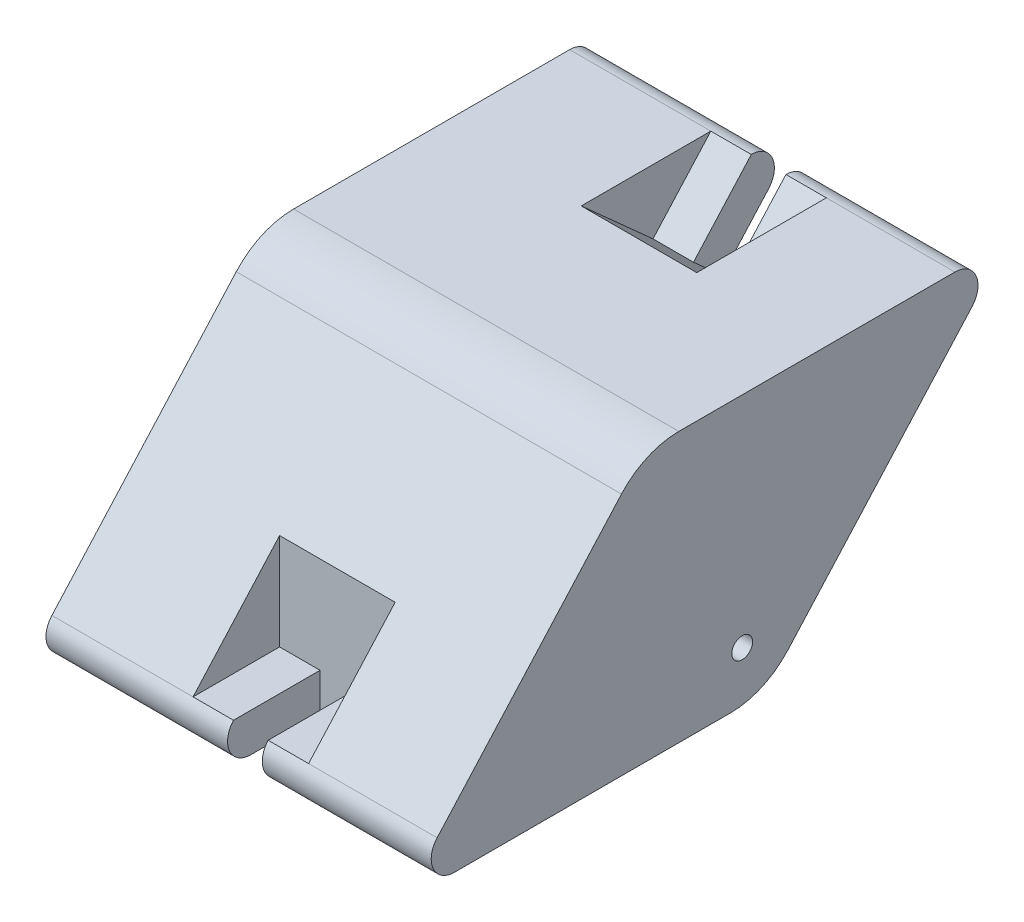
ISO-10303-21;
HEADER;
FILE_DESCRIPTION(('STEP AP214'),'2;1');
FILE_NAME('part.step','',(''),(''),'','','');
FILE_SCHEMA(('AUTOMOTIVE_DESIGN { 1 0 10303 214 1 1 1 1 }'));
ENDSEC;
DATA;
#1=APPLICATION_CONTEXT('core data for automotive mechanical design processes');
#2=APPLICATION_PROTOCOL_DEFINITION('international standard','automotive_design',2000,#1);
#3=PRODUCT_CONTEXT('',#1,'mechanical');
#4=PRODUCT('Part','Part','',(#3));
#5=PRODUCT_RELATED_PRODUCT_CATEGORY('part','',(#4));
#6=PRODUCT_DEFINITION_FORMATION('','',#4);
#7=PRODUCT_DEFINITION_CONTEXT('part definition',#1,'design');
#8=PRODUCT_DEFINITION('design','',#6,#7);
#9=PRODUCT_DEFINITION_SHAPE('','',#8);
#10=(LENGTH_UNIT() NAMED_UNIT(*) SI_UNIT(.MILLI.,.METRE.));
#11=(NAMED_UNIT(*) PLANE_ANGLE_UNIT() SI_UNIT($,.RADIAN.));
#12=(NAMED_UNIT(*) SI_UNIT($,.STERADIAN.) SOLID_ANGLE_UNIT());
#13=UNCERTAINTY_MEASURE_WITH_UNIT(LENGTH_MEASURE(1.E-05),#10,'distance_accuracy_value','');
#14=(GEOMETRIC_REPRESENTATION_CONTEXT(3) GLOBAL_UNCERTAINTY_ASSIGNED_CONTEXT((#13)) GLOBAL_UNIT_ASSIGNED_CONTEXT((#10,
#11,#12)) REPRESENTATION_CONTEXT('',''));
#15=CARTESIAN_POINT('',(0.,0.,0.));
#16=DIRECTION('',(0.,0.,1.));
#17=DIRECTION('',(1.,0.,0.));
#18=AXIS2_PLACEMENT_3D('',#15,#16,#17);
#19=CARTESIAN_POINT('',(10.,13.2280083122286,21.456777394603));
#20=DIRECTION('',(0.,-0.66777921611463,-0.744359401448877));
#21=DIRECTION('',(0.,0.744359401448877,-0.66777921611463));
#22=AXIS2_PLACEMENT_3D('',#19,#20,#21);
#23=PLANE('',#22);
#24=DIRECTION('',(0.,0.744359401448877,-0.66777921611463));
#25=VECTOR('',#24,1.);
#26=CARTESIAN_POINT('',(33.32,13.2280083122286,21.456777394603));
#27=LINE('',#26,#25);
#28=CARTESIAN_POINT('',(33.32,-13.4464462005738,45.3869464637014));
#29=VERTEX_POINT('',#28);
#30=CARTESIAN_POINT('',(33.32,-0.925170954444308,34.1538682593548));
#31=VERTEX_POINT('',#30);
#32=EDGE_CURVE('E11',#29,#31,#27,.T.);
#33=ORIENTED_EDGE('',*,*,#32,.F.);
#34=DIRECTION('',(-1.,0.,0.));
#35=VECTOR('',#34,1.);
#36=CARTESIAN_POINT('',(10.,-13.4464462005738,45.3869464637014));
#37=LINE('',#36,#35);
#38=CARTESIAN_POINT('',(50.,-13.4464462005738,45.3869464637014));
#39=VERTEX_POINT('',#38);
#40=EDGE_CURVE('E389',#39,#29,#37,.T.);
#41=ORIENTED_EDGE('',*,*,#40,.F.);
#42=DIRECTION('',(0.,-0.744359401448877,0.66777921611463));
#43=VECTOR('',#42,1.);
#44=CARTESIAN_POINT('',(50.,16.5642253922856,18.4637925244284));
#45=LINE('',#44,#43);
#46=CARTESIAN_POINT('',(50.,13.2280083122286,21.456777394603));
#47=VERTEX_POINT('',#46);
#48=EDGE_CURVE('E315',#47,#39,#45,.T.);
#49=ORIENTED_EDGE('',*,*,#48,.F.);
#50=DIRECTION('',(-1.,0.,0.));
#51=VECTOR('',#50,1.);
#52=CARTESIAN_POINT('',(10.,13.2280083122286,21.456777394603));
#53=LINE('',#52,#51);
#54=CARTESIAN_POINT('',(0.,13.2280083122286,21.456777394603));
#55=VERTEX_POINT('',#54);
#56=EDGE_CURVE('E392',#47,#55,#53,.T.);
#57=ORIENTED_EDGE('',*,*,#56,.T.);
#58=DIRECTION('',(0.,-0.744359401448877,0.66777921611463));
#59=VECTOR('',#58,1.);
#60=CARTESIAN_POINT('',(0.,13.2280083122286,21.456777394603));
#61=LINE('',#60,#59);
#62=CARTESIAN_POINT('',(0.,-13.4464462005738,45.3869464637014));
#63=VERTEX_POINT('',#62);
#64=EDGE_CURVE('E375',#55,#63,#61,.T.);
#65=ORIENTED_EDGE('',*,*,#64,.T.);
#66=CARTESIAN_POINT('',(18.32,-13.4464462005738,45.3869464637014));
#67=VERTEX_POINT('',#66);
#68=EDGE_CURVE('E388',#67,#63,#37,.T.);
#69=ORIENTED_EDGE('',*,*,#68,.F.);
#70=DIRECTION('',(0.,-0.744359401448877,0.66777921611463));
#71=VECTOR('',#70,1.);
#72=CARTESIAN_POINT('',(18.32,13.2280083122286,21.456777394603));
#73=LINE('',#72,#71);
#74=CARTESIAN_POINT('',(18.32,-0.925170954444308,34.1538682593548));
#75=VERTEX_POINT('',#74);
#76=EDGE_CURVE('E213',#75,#67,#73,.T.);
#77=ORIENTED_EDGE('',*,*,#76,.F.);
#78=DIRECTION('',(1.,0.,0.));
#79=VECTOR('',#78,1.);
#80=CARTESIAN_POINT('',(10.,-0.925170954444308,34.1538682593548));
#81=LINE('',#80,#79);
#82=EDGE_CURVE('E226',#75,#31,#81,.T.);
#83=ORIENTED_EDGE('',*,*,#82,.T.);
#84=EDGE_LOOP('',(#33,#41,#49,#57,#65,#69,#77,#83));
#85=FACE_BOUND('',#84,.T.);
#86=ADVANCED_FACE('F36',(#85),#23,.F.);
#87=CARTESIAN_POINT('',(28.07,-31.265789466894,34.1538682593548));
#88=DIRECTION('',(1.,0.,0.));
#89=DIRECTION('',(0.,0.,-1.));
#90=AXIS2_PLACEMENT_3D('',#87,#88,#89);
#91=PLANE('',#90);
#92=DIRECTION('',(0.,0.,1.));
#93=VECTOR('',#92,1.);
#94=CARTESIAN_POINT('',(28.07,-13.4464462005738,34.1538682593548));
#95=LINE('',#94,#93);
#96=CARTESIAN_POINT('',(28.07,-13.4464462005738,34.1538682593548));
#97=VERTEX_POINT('',#96);
#98=CARTESIAN_POINT('',(28.07,-13.4464462005738,45.3869464637014));
#99=VERTEX_POINT('',#98);
#100=EDGE_CURVE('E233',#97,#99,#95,.T.);
#101=ORIENTED_EDGE('',*,*,#100,.F.);
#102=DIRECTION('',(0.,1.,0.));
#103=VECTOR('',#102,1.);
#104=CARTESIAN_POINT('',(28.07,-31.265789466894,34.1538682593548));
#105=LINE('',#104,#103);
#106=CARTESIAN_POINT('',(28.07,-18.4497838489177,34.1538682593548));
#107=VERTEX_POINT('',#106);
#108=EDGE_CURVE('E238',#107,#97,#105,.T.);
#109=ORIENTED_EDGE('',*,*,#108,.F.);
#110=DIRECTION('',(0.,0.,1.));
#111=VECTOR('',#110,1.);
#112=CARTESIAN_POINT('',(28.07,-18.4497838489177,34.1538682593548));
#113=LINE('',#112,#111);
#114=CARTESIAN_POINT('',(28.07,-18.4497838489177,43.1538682593548));
#115=VERTEX_POINT('',#114);
#116=EDGE_CURVE('E239',#107,#115,#113,.T.);
#117=ORIENTED_EDGE('',*,*,#116,.T.);
#118=CARTESIAN_POINT('',(28.07,-15.4497838489177,43.1538682593548));
#119=DIRECTION('',(1.,0.,0.));
#120=DIRECTION('',(0.,0.,-1.));
#121=AXIS2_PLACEMENT_3D('',#118,#119,#120);
#122=CIRCLE('',#121,3.);
#123=EDGE_CURVE('E251',#99,#115,#122,.T.);
#124=ORIENTED_EDGE('',*,*,#123,.F.);
#125=EDGE_LOOP('',(#101,#109,#117,#124));
#126=FACE_BOUND('',#125,.T.);
#127=ADVANCED_FACE('F471',(#126),#91,.F.);
#128=CARTESIAN_POINT('',(23.57,-31.265789466894,34.1538682593548));
#129=DIRECTION('',(-1.,0.,0.));
#130=DIRECTION('',(0.,0.,1.));
#131=AXIS2_PLACEMENT_3D('',#128,#129,#130);
#132=PLANE('',#131);
#133=DIRECTION('',(0.,0.,-1.));
#134=VECTOR('',#133,1.);
#135=CARTESIAN_POINT('',(23.57,-13.4464462005738,34.1538682593548));
#136=LINE('',#135,#134);
#137=CARTESIAN_POINT('',(23.57,-13.4464462005738,45.3869464637014));
#138=VERTEX_POINT('',#137);
#139=CARTESIAN_POINT('',(23.57,-13.4464462005738,34.1538682593548));
#140=VERTEX_POINT('',#139);
#141=EDGE_CURVE('E216',#138,#140,#136,.T.);
#142=ORIENTED_EDGE('',*,*,#141,.F.);
#143=CARTESIAN_POINT('',(23.57,-15.4497838489177,43.1538682593548));
#144=DIRECTION('',(-1.,0.,0.));
#145=DIRECTION('',(0.,0.,1.));
#146=AXIS2_PLACEMENT_3D('',#143,#144,#145);
#147=CIRCLE('',#146,3.);
#148=CARTESIAN_POINT('',(23.57,-18.4497838489177,43.1538682593548));
#149=VERTEX_POINT('',#148);
#150=EDGE_CURVE('E248',#149,#138,#147,.T.);
#151=ORIENTED_EDGE('',*,*,#150,.F.);
#152=DIRECTION('',(0.,0.,1.));
#153=VECTOR('',#152,1.);
#154=CARTESIAN_POINT('',(23.57,-18.4497838489177,43.1538682593548));
#155=LINE('',#154,#153);
#156=CARTESIAN_POINT('',(23.57,-18.4497838489177,34.1538682593548));
#157=VERTEX_POINT('',#156);
#158=EDGE_CURVE('E44',#157,#149,#155,.T.);
#159=ORIENTED_EDGE('',*,*,#158,.F.);
#160=DIRECTION('',(0.,1.,0.));
#161=VECTOR('',#160,1.);
#162=CARTESIAN_POINT('',(23.57,-31.265789466894,34.1538682593548));
#163=LINE('',#162,#161);
#164=EDGE_CURVE('E56',#157,#140,#163,.T.);
#165=ORIENTED_EDGE('',*,*,#164,.T.);
#166=EDGE_LOOP('',(#142,#151,#159,#165));
#167=FACE_BOUND('',#166,.T.);
#168=ADVANCED_FACE('F479',(#167),#132,.F.);
#169=CARTESIAN_POINT('',(10.,-15.4497838489177,43.1538682593548));
#170=DIRECTION('',(-1.,0.,0.));
#171=DIRECTION('',(0.,0.,1.));
#172=AXIS2_PLACEMENT_3D('',#169,#170,#171);
#173=CYLINDRICAL_SURFACE('',#172,3.);
#174=ORIENTED_EDGE('',*,*,#123,.T.);
#175=DIRECTION('',(-1.,0.,0.));
#176=VECTOR('',#175,1.);
#177=CARTESIAN_POINT('',(10.,-18.4497838489177,43.1538682593548));
#178=LINE('',#177,#176);
#179=CARTESIAN_POINT('',(50.,-18.4497838489177,43.1538682593548));
#180=VERTEX_POINT('',#179);
#181=EDGE_CURVE('E385',#180,#115,#178,.T.);
#182=ORIENTED_EDGE('',*,*,#181,.F.);
#183=CARTESIAN_POINT('',(50.,-15.4497838489177,43.1538682593548));
#184=DIRECTION('',(1.,0.,0.));
#185=DIRECTION('',(0.,0.,-1.));
#186=AXIS2_PLACEMENT_3D('',#183,#184,#185);
#187=CIRCLE('',#186,3.);
#188=EDGE_CURVE('E318',#39,#180,#187,.T.);
#189=ORIENTED_EDGE('',*,*,#188,.F.);
#190=ORIENTED_EDGE('',*,*,#40,.T.);
#191=DIRECTION('',(1.,0.,0.));
#192=VECTOR('',#191,1.);
#193=CARTESIAN_POINT('',(10.,-13.4464462005738,45.3869464637014));
#194=LINE('',#193,#192);
#195=EDGE_CURVE('E235',#99,#29,#194,.T.);
#196=ORIENTED_EDGE('',*,*,#195,.F.);
#197=EDGE_LOOP('',(#174,#182,#189,#190,#196));
#198=FACE_BOUND('',#197,.T.);
#199=ADVANCED_FACE('F465',(#198),#173,.T.);
#200=CARTESIAN_POINT('',(10.,16.5502161510823,14.0131833801142));
#201=DIRECTION('',(0.,-1.,0.));
#202=DIRECTION('',(0.,0.,-1.));
#203=AXIS2_PLACEMENT_3D('',#200,#201,#202);
#204=PLANE('',#203);
#205=DIRECTION('',(0.,0.,-1.));
#206=VECTOR('',#205,1.);
#207=CARTESIAN_POINT('',(33.32,16.5502161510823,14.0131833801142));
#208=LINE('',#207,#206);
#209=CARTESIAN_POINT('',(33.32,16.5502161510823,-5.00072205202531));
#210=VERTEX_POINT('',#209);
#211=CARTESIAN_POINT('',(33.32,16.5502161510823,-21.8222671574638));
#212=VERTEX_POINT('',#211);
#213=EDGE_CURVE('E421',#210,#212,#208,.T.);
#214=ORIENTED_EDGE('',*,*,#213,.F.);
#215=DIRECTION('',(-1.,0.,0.));
#216=VECTOR('',#215,1.);
#217=CARTESIAN_POINT('',(10.,16.5502161510823,-5.00072205202531));
#218=LINE('',#217,#216);
#219=CARTESIAN_POINT('',(18.32,16.5502161510823,-5.00072205202531));
#220=VERTEX_POINT('',#219);
#221=EDGE_CURVE('E414',#210,#220,#218,.T.);
#222=ORIENTED_EDGE('',*,*,#221,.T.);
#223=DIRECTION('',(0.,0.,1.));
#224=VECTOR('',#223,1.);
#225=CARTESIAN_POINT('',(18.32,16.5502161510823,14.0131833801142));
#226=LINE('',#225,#224);
#227=CARTESIAN_POINT('',(18.32,16.5502161510823,-21.8222671574638));
#228=VERTEX_POINT('',#227);
#229=EDGE_CURVE('E418',#228,#220,#226,.T.);
#230=ORIENTED_EDGE('',*,*,#229,.F.);
#231=DIRECTION('',(-1.,0.,0.));
#232=VECTOR('',#231,1.);
#233=CARTESIAN_POINT('',(10.,16.5502161510823,-21.8222671574638));
#234=LINE('',#233,#232);
#235=CARTESIAN_POINT('',(0.,16.5502161510823,-21.8222671574638));
#236=VERTEX_POINT('',#235);
#237=EDGE_CURVE('E399',#228,#236,#234,.T.);
#238=ORIENTED_EDGE('',*,*,#237,.T.);
#239=DIRECTION('',(0.,0.,1.));
#240=VECTOR('',#239,1.);
#241=CARTESIAN_POINT('',(0.,16.5502161510823,14.0131833801142));
#242=LINE('',#241,#240);
#243=CARTESIAN_POINT('',(0.,16.5502161510823,14.0131833801142));
#244=VERTEX_POINT('',#243);
#245=EDGE_CURVE('E371',#236,#244,#242,.T.);
#246=ORIENTED_EDGE('',*,*,#245,.T.);
#247=DIRECTION('',(-1.,0.,0.));
#248=VECTOR('',#247,1.);
#249=CARTESIAN_POINT('',(10.,16.5502161510823,14.0131833801142));
#250=LINE('',#249,#248);
#251=CARTESIAN_POINT('',(50.,16.5502161510823,14.0131833801142));
#252=VERTEX_POINT('',#251);
#253=EDGE_CURVE('E396',#252,#244,#250,.T.);
#254=ORIENTED_EDGE('',*,*,#253,.F.);
#255=DIRECTION('',(0.,0.,1.));
#256=VECTOR('',#255,1.);
#257=CARTESIAN_POINT('',(50.,16.5502161510823,0.));
#258=LINE('',#257,#256);
#259=CARTESIAN_POINT('',(50.,16.5502161510823,-21.8222671574638));
#260=VERTEX_POINT('',#259);
#261=EDGE_CURVE('E309',#260,#252,#258,.T.);
#262=ORIENTED_EDGE('',*,*,#261,.F.);
#263=EDGE_CURVE('E400',#260,#212,#234,.T.);
#264=ORIENTED_EDGE('',*,*,#263,.T.);
#265=EDGE_LOOP('',(#214,#222,#230,#238,#246,#254,#262,#264));
#266=FACE_BOUND('',#265,.T.);
#267=ADVANCED_FACE('F486',(#266),#204,.F.);
#268=CARTESIAN_POINT('',(28.07,5.22169452179214,-35.5983972809166));
#269=DIRECTION('',(1.,0.,0.));
#270=DIRECTION('',(0.,0.,-1.));
#271=AXIS2_PLACEMENT_3D('',#268,#269,#270);
#272=PLANE('',#271);
#273=DIRECTION('',(0.,-0.744359401448877,0.66777921611463));
#274=VECTOR('',#273,1.);
#275=CARTESIAN_POINT('',(28.07,17.121081599853,-22.3344015929865));
#276=LINE('',#275,#274);
#277=CARTESIAN_POINT('',(28.07,16.5502161510823,-21.8222671574638));
#278=VERTEX_POINT('',#277);
#279=CARTESIAN_POINT('',(28.07,8.18876878246644,-14.3210509996109));
#280=VERTEX_POINT('',#279);
#281=EDGE_CURVE('E266',#278,#280,#276,.T.);
#282=ORIENTED_EDGE('',*,*,#281,.F.);
#283=CARTESIAN_POINT('',(28.07,13.5502161510823,-21.8222671574638));
#284=DIRECTION('',(1.,0.,0.));
#285=DIRECTION('',(0.,0.,-1.));
#286=AXIS2_PLACEMENT_3D('',#283,#284,#285);
#287=CIRCLE('',#286,3.);
#288=CARTESIAN_POINT('',(28.07,11.5468785027384,-24.0553453618105));
#289=VERTEX_POINT('',#288);
#290=EDGE_CURVE('E286',#289,#278,#287,.T.);
#291=ORIENTED_EDGE('',*,*,#290,.F.);
#292=DIRECTION('',(0.,-0.744359401448877,0.66777921611463));
#293=VECTOR('',#292,1.);
#294=CARTESIAN_POINT('',(28.07,13.779956707085,-26.0586830101543));
#295=LINE('',#294,#293);
#296=CARTESIAN_POINT('',(28.07,4.84764388969853,-18.0453324167788));
#297=VERTEX_POINT('',#296);
#298=EDGE_CURVE('E278',#289,#297,#295,.T.);
#299=ORIENTED_EDGE('',*,*,#298,.T.);
#300=DIRECTION('',(0.,0.66777921611463,0.744359401448877));
#301=VECTOR('',#300,1.);
#302=CARTESIAN_POINT('',(28.07,-3.71061829559437,-27.5850466875411));
#303=LINE('',#302,#301);
#304=EDGE_CURVE('E276',#297,#280,#303,.T.);
#305=ORIENTED_EDGE('',*,*,#304,.T.);
#306=EDGE_LOOP('',(#282,#291,#299,#305));
#307=FACE_BOUND('',#306,.T.);
#308=ADVANCED_FACE('F504',(#307),#272,.F.);
#309=CARTESIAN_POINT('',(23.57,5.22169452179214,-35.5983972809166));
#310=DIRECTION('',(-1.,0.,0.));
#311=DIRECTION('',(0.,0.,1.));
#312=AXIS2_PLACEMENT_3D('',#309,#310,#311);
#313=PLANE('',#312);
#314=DIRECTION('',(0.,0.744359401448877,-0.66777921611463));
#315=VECTOR('',#314,1.);
#316=CARTESIAN_POINT('',(23.57,17.121081599853,-22.3344015929865));
#317=LINE('',#316,#315);
#318=CARTESIAN_POINT('',(23.57,8.18876878246644,-14.3210509996109));
#319=VERTEX_POINT('',#318);
#320=CARTESIAN_POINT('',(23.57,16.5502161510823,-21.8222671574638));
#321=VERTEX_POINT('',#320);
#322=EDGE_CURVE('E416',#319,#321,#317,.T.);
#323=ORIENTED_EDGE('',*,*,#322,.F.);
#324=DIRECTION('',(0.,0.66777921611463,0.744359401448877));
#325=VECTOR('',#324,1.);
#326=CARTESIAN_POINT('',(23.57,-3.71061829559437,-27.5850466875411));
#327=LINE('',#326,#325);
#328=CARTESIAN_POINT('',(23.57,4.84764388969853,-18.0453324167788));
#329=VERTEX_POINT('',#328);
#330=EDGE_CURVE('E269',#329,#319,#327,.T.);
#331=ORIENTED_EDGE('',*,*,#330,.F.);
#332=DIRECTION('',(0.,0.744359401448877,-0.66777921611463));
#333=VECTOR('',#332,1.);
#334=CARTESIAN_POINT('',(23.57,13.779956707085,-26.0586830101543));
#335=LINE('',#334,#333);
#336=CARTESIAN_POINT('',(23.57,11.5468785027384,-24.0553453618105));
#337=VERTEX_POINT('',#336);
#338=EDGE_CURVE('E272',#329,#337,#335,.T.);
#339=ORIENTED_EDGE('',*,*,#338,.T.);
#340=CARTESIAN_POINT('',(23.57,13.5502161510823,-21.8222671574638));
#341=DIRECTION('',(-1.,0.,0.));
#342=DIRECTION('',(0.,0.,1.));
#343=AXIS2_PLACEMENT_3D('',#340,#341,#342);
#344=CIRCLE('',#343,3.);
#345=EDGE_CURVE('E280',#321,#337,#344,.T.);
#346=ORIENTED_EDGE('',*,*,#345,.F.);
#347=EDGE_LOOP('',(#323,#331,#339,#346));
#348=FACE_BOUND('',#347,.T.);
#349=ADVANCED_FACE('F526',(#348),#313,.F.);
#350=CARTESIAN_POINT('',(10.,13.5502161510823,-21.8222671574638));
#351=DIRECTION('',(-1.,0.,0.));
#352=DIRECTION('',(0.,0.,1.));
#353=AXIS2_PLACEMENT_3D('',#350,#351,#352);
#354=CYLINDRICAL_SURFACE('',#353,3.);
#355=ORIENTED_EDGE('',*,*,#345,.T.);
#356=DIRECTION('',(-1.,0.,0.));
#357=VECTOR('',#356,1.);
#358=CARTESIAN_POINT('',(10.,11.5468785027384,-24.0553453618104));
#359=LINE('',#358,#357);
#360=CARTESIAN_POINT('',(0.,11.5468785027384,-24.0553453618104));
#361=VERTEX_POINT('',#360);
#362=EDGE_CURVE('E403',#337,#361,#359,.T.);
#363=ORIENTED_EDGE('',*,*,#362,.T.);
#364=CARTESIAN_POINT('',(0.,13.5502161510823,-21.8222671574638));
#365=DIRECTION('',(1.,0.,0.));
#366=DIRECTION('',(0.,0.,-1.));
#367=AXIS2_PLACEMENT_3D('',#364,#365,#366);
#368=CIRCLE('',#367,3.);
#369=EDGE_CURVE('E368',#361,#236,#368,.T.);
#370=ORIENTED_EDGE('',*,*,#369,.T.);
#371=ORIENTED_EDGE('',*,*,#237,.F.);
#372=EDGE_CURVE('E404',#321,#228,#234,.T.);
#373=ORIENTED_EDGE('',*,*,#372,.F.);
#374=EDGE_LOOP('',(#355,#363,#370,#371,#373));
#375=FACE_BOUND('',#374,.T.);
#376=ADVANCED_FACE('F509',(#375),#354,.T.);
#377=CARTESIAN_POINT('',(45.,0.,0.));
#378=DIRECTION('',(1.,0.,0.));
#379=DIRECTION('',(0.,0.,-1.));
#380=AXIS2_PLACEMENT_3D('',#377,#378,#379);
#381=PLANE('',#380);
#382=DIRECTION('',(0.,0.,1.));
#383=VECTOR('',#382,1.);
#384=CARTESIAN_POINT('',(45.,-18.4497838489177,0.));
#385=LINE('',#384,#383);
#386=CARTESIAN_POINT('',(45.,-18.4497838489177,7.31841772177667));
#387=VERTEX_POINT('',#386);
#388=CARTESIAN_POINT('',(45.,-18.4497838489177,31.0090755306168));
#389=VERTEX_POINT('',#388);
#390=EDGE_CURVE('E303',#387,#389,#385,.T.);
#391=ORIENTED_EDGE('',*,*,#390,.T.);
#392=CARTESIAN_POINT('',(45.,-11.5096495734594,5.95274545699105));
#393=DIRECTION('',(-1.,0.,0.));
#394=DIRECTION('',(0.,0.,1.));
#395=AXIS2_PLACEMENT_3D('',#392,#393,#394);
#396=CIRCLE('',#395,25.9997142391964);
#397=CARTESIAN_POINT('',(45.,2.50678785645429,-15.9453051935391));
#398=VERTEX_POINT('',#397);
#399=EDGE_CURVE('E336',#389,#398,#396,.T.);
#400=ORIENTED_EDGE('',*,*,#399,.T.);
#401=DIRECTION('',(0.,0.744359401448877,-0.66777921611463));
#402=VECTOR('',#401,1.);
#403=CARTESIAN_POINT('',(45.,-6.80804717172648,-7.58878652628227));
#404=LINE('',#403,#402);
#405=CARTESIAN_POINT('',(45.,-15.127576010064,-0.125176292712019));
#406=VERTEX_POINT('',#405);
#407=EDGE_CURVE('E327',#406,#398,#404,.T.);
#408=ORIENTED_EDGE('',*,*,#407,.F.);
#409=CARTESIAN_POINT('',(45.,-8.44978384891769,7.31841772177678));
#410=DIRECTION('',(1.,0.,0.));
#411=DIRECTION('',(0.,0.,-1.));
#412=AXIS2_PLACEMENT_3D('',#409,#410,#411);
#413=CIRCLE('',#412,10.);
#414=EDGE_CURVE('E298',#406,#387,#413,.F.);
#415=ORIENTED_EDGE('',*,*,#414,.T.);
#416=EDGE_LOOP('',(#391,#400,#408,#415));
#417=FACE_BOUND('',#416,.T.);
#418=CARTESIAN_POINT('',(45.,-11.8749197984836,5.78971888642409));
#419=DIRECTION('',(1.,0.,0.));
#420=DIRECTION('',(0.,0.,-1.));
#421=AXIS2_PLACEMENT_3D('',#418,#419,#420);
#422=CIRCLE('',#421,3.);
#423=CARTESIAN_POINT('',(45.,-11.8749197984836,2.78971888642409));
#424=VERTEX_POINT('',#423);
#425=EDGE_CURVE('E411',#424,#424,#422,.F.);
#426=ORIENTED_EDGE('',*,*,#425,.F.);
#427=EDGE_LOOP('',(#426));
#428=FACE_BOUND('',#427,.T.);
#429=ADVANCED_FACE('F452',(#417,#428),#381,.F.);
#430=CARTESIAN_POINT('',(10.,-8.44978384891769,7.31841772177678));
#431=DIRECTION('',(1.,0.,0.));
#432=DIRECTION('',(0.,0.,-1.));
#433=AXIS2_PLACEMENT_3D('',#430,#431,#432);
#434=PLANE('',#433);
#435=CARTESIAN_POINT('',(10.,-11.5096495734594,5.95274545699105));
#436=DIRECTION('',(1.,0.,0.));
#437=DIRECTION('',(0.,0.,-1.));
#438=AXIS2_PLACEMENT_3D('',#435,#436,#437);
#439=CIRCLE('',#438,3.6);
#440=CARTESIAN_POINT('',(10.,-11.5096495734594,2.35274545699105));
#441=VERTEX_POINT('',#440);
#442=EDGE_CURVE('E348',#441,#441,#439,.T.);
#443=ORIENTED_EDGE('',*,*,#442,.F.);
#444=EDGE_LOOP('',(#443));
#445=FACE_BOUND('',#444,.T.);
#446=CARTESIAN_POINT('',(10.,-11.5096495734594,5.95274545699105));
#447=DIRECTION('',(-1.,0.,0.));
#448=DIRECTION('',(0.,0.,1.));
#449=AXIS2_PLACEMENT_3D('',#446,#447,#448);
#450=CIRCLE('',#449,25.9997142391964);
#451=CARTESIAN_POINT('',(10.,-18.4497838489177,31.0090755306168));
#452=VERTEX_POINT('',#451);
#453=CARTESIAN_POINT('',(10.,2.50678785645429,-15.9453051935391));
#454=VERTEX_POINT('',#453);
#455=EDGE_CURVE('E335',#452,#454,#450,.T.);
#456=ORIENTED_EDGE('',*,*,#455,.F.);
#457=DIRECTION('',(0.,0.,-1.));
#458=VECTOR('',#457,1.);
#459=CARTESIAN_POINT('',(10.,-18.4497838489177,43.1538682593548));
#460=LINE('',#459,#458);
#461=CARTESIAN_POINT('',(10.,-18.4497838489177,7.31841772177682));
#462=VERTEX_POINT('',#461);
#463=EDGE_CURVE('E360',#452,#462,#460,.T.);
#464=ORIENTED_EDGE('',*,*,#463,.T.);
#465=CARTESIAN_POINT('',(10.,-8.44978384891769,7.31841772177678));
#466=DIRECTION('',(1.,0.,0.));
#467=DIRECTION('',(0.,0.,-1.));
#468=AXIS2_PLACEMENT_3D('',#465,#466,#467);
#469=CIRCLE('',#468,10.);
#470=CARTESIAN_POINT('',(10.,-15.127576010064,-0.125176292712019));
#471=VERTEX_POINT('',#470);
#472=EDGE_CURVE('E354',#462,#471,#469,.T.);
#473=ORIENTED_EDGE('',*,*,#472,.T.);
#474=DIRECTION('',(0.,0.744359401448877,-0.66777921611463));
#475=VECTOR('',#474,1.);
#476=CARTESIAN_POINT('',(10.,11.5468785027384,-24.0553453618104));
#477=LINE('',#476,#475);
#478=EDGE_CURVE('E357',#471,#454,#477,.T.);
#479=ORIENTED_EDGE('',*,*,#478,.T.);
#480=EDGE_LOOP('',(#456,#464,#473,#479));
#481=FACE_BOUND('',#480,.T.);
#482=ADVANCED_FACE('F445',(#445,#481),#434,.T.);
#483=CARTESIAN_POINT('',(0.,-8.44978384891769,7.31841772177678));
#484=DIRECTION('',(1.,0.,0.));
#485=DIRECTION('',(0.,0.,-1.));
#486=AXIS2_PLACEMENT_3D('',#483,#484,#485);
#487=PLANE('',#486);
#488=CARTESIAN_POINT('',(0.,-8.44978384891769,7.31841772177678));
#489=DIRECTION('',(1.,0.,0.));
#490=DIRECTION('',(0.,0.,-1.));
#491=AXIS2_PLACEMENT_3D('',#488,#489,#490);
#492=CIRCLE('',#491,10.);
#493=CARTESIAN_POINT('',(0.,-18.4497838489177,7.31841772177682));
#494=VERTEX_POINT('',#493);
#495=CARTESIAN_POINT('',(0.,-15.127576010064,-0.125176292712019));
#496=VERTEX_POINT('',#495);
#497=EDGE_CURVE('E351',#494,#496,#492,.T.);
#498=ORIENTED_EDGE('',*,*,#497,.F.);
#499=DIRECTION('',(0.,0.,-1.));
#500=VECTOR('',#499,1.);
#501=CARTESIAN_POINT('',(0.,-18.4497838489177,43.1538682593548));
#502=LINE('',#501,#500);
#503=CARTESIAN_POINT('',(0.,-18.4497838489177,43.1538682593548));
#504=VERTEX_POINT('',#503);
#505=EDGE_CURVE('E358',#504,#494,#502,.T.);
#506=ORIENTED_EDGE('',*,*,#505,.F.);
#507=CARTESIAN_POINT('',(0.,-15.4497838489177,43.1538682593548));
#508=DIRECTION('',(1.,0.,0.));
#509=DIRECTION('',(0.,0.,-1.));
#510=AXIS2_PLACEMENT_3D('',#507,#508,#509);
#511=CIRCLE('',#510,3.);
#512=EDGE_CURVE('E378',#63,#504,#511,.T.);
#513=ORIENTED_EDGE('',*,*,#512,.F.);
#514=ORIENTED_EDGE('',*,*,#64,.F.);
#515=CARTESIAN_POINT('',(0.,6.55021615108231,14.0131833801142));
#516=DIRECTION('',(1.,0.,0.));
#517=DIRECTION('',(0.,0.,1.));
#518=AXIS2_PLACEMENT_3D('',#515,#516,#517);
#519=CIRCLE('',#518,10.);
#520=EDGE_CURVE('E373',#244,#55,#519,.T.);
#521=ORIENTED_EDGE('',*,*,#520,.F.);
#522=ORIENTED_EDGE('',*,*,#245,.F.);
#523=ORIENTED_EDGE('',*,*,#369,.F.);
#524=DIRECTION('',(0.,0.744359401448877,-0.66777921611463));
#525=VECTOR('',#524,1.);
#526=CARTESIAN_POINT('',(0.,11.5468785027384,-24.0553453618104));
#527=LINE('',#526,#525);
#528=EDGE_CURVE('E365',#496,#361,#527,.T.);
#529=ORIENTED_EDGE('',*,*,#528,.F.);
#530=EDGE_LOOP('',(#498,#506,#513,#514,#521,#522,#523,#529));
#531=FACE_BOUND('',#530,.T.);
#532=CARTESIAN_POINT('',(0.,-11.5096495734594,5.95274545699105));
#533=DIRECTION('',(1.,0.,0.));
#534=DIRECTION('',(0.,0.,-1.));
#535=AXIS2_PLACEMENT_3D('',#532,#533,#534);
#536=CIRCLE('',#535,3.6);
#537=CARTESIAN_POINT('',(0.,-11.5096495734594,2.35274545699105));
#538=VERTEX_POINT('',#537);
#539=EDGE_CURVE('E347',#538,#538,#536,.T.);
#540=ORIENTED_EDGE('',*,*,#539,.T.);
#541=EDGE_LOOP('',(#540));
#542=FACE_BOUND('',#541,.T.);
#543=ADVANCED_FACE('F437',(#531,#542),#487,.F.);
#544=CARTESIAN_POINT('',(10.,-8.44978384891769,7.31841772177678));
#545=DIRECTION('',(-1.,0.,0.));
#546=DIRECTION('',(0.,0.,1.));
#547=AXIS2_PLACEMENT_3D('',#544,#545,#546);
#548=CYLINDRICAL_SURFACE('',#547,10.);
#549=ORIENTED_EDGE('',*,*,#497,.T.);
#550=DIRECTION('',(-1.,0.,0.));
#551=VECTOR('',#550,1.);
#552=CARTESIAN_POINT('',(10.,-15.127576010064,-0.125176292712019));
#553=LINE('',#552,#551);
#554=EDGE_CURVE('E408',#471,#496,#553,.T.);
#555=ORIENTED_EDGE('',*,*,#554,.F.);
#556=ORIENTED_EDGE('',*,*,#472,.F.);
#557=DIRECTION('',(-1.,0.,0.));
#558=VECTOR('',#557,1.);
#559=CARTESIAN_POINT('',(10.,-18.4497838489177,7.31841772177682));
#560=LINE('',#559,#558);
#561=EDGE_CURVE('E362',#462,#494,#560,.T.);
#562=ORIENTED_EDGE('',*,*,#561,.T.);
#563=EDGE_LOOP('',(#549,#555,#556,#562));
#564=FACE_BOUND('',#563,.T.);
#565=ADVANCED_FACE('F38',(#564),#548,.T.);
#566=CARTESIAN_POINT('',(10.,11.5468785027384,-24.0553453618104));
#567=DIRECTION('',(0.,0.66777921611463,0.744359401448877));
#568=DIRECTION('',(0.,-0.744359401448877,0.66777921611463));
#569=AXIS2_PLACEMENT_3D('',#566,#567,#568);
#570=PLANE('',#569);
#571=DIRECTION('',(-1.,0.,0.));
#572=VECTOR('',#571,1.);
#573=CARTESIAN_POINT('',(28.07,4.84764388969853,-18.0453324167788));
#574=LINE('',#573,#572);
#575=EDGE_CURVE('E275',#297,#329,#574,.T.);
#576=ORIENTED_EDGE('',*,*,#575,.F.);
#577=ORIENTED_EDGE('',*,*,#298,.F.);
#578=CARTESIAN_POINT('',(50.,11.5468785027384,-24.0553453618104));
#579=VERTEX_POINT('',#578);
#580=EDGE_CURVE('E405',#579,#289,#359,.T.);
#581=ORIENTED_EDGE('',*,*,#580,.F.);
#582=DIRECTION('',(0.,0.744359401448877,-0.66777921611463));
#583=VECTOR('',#582,1.);
#584=CARTESIAN_POINT('',(50.,-6.80804717172648,-7.58878652628227));
#585=LINE('',#584,#583);
#586=CARTESIAN_POINT('',(50.,-15.127576010064,-0.125176292712019));
#587=VERTEX_POINT('',#586);
#588=EDGE_CURVE('E302',#587,#579,#585,.T.);
#589=ORIENTED_EDGE('',*,*,#588,.F.);
#590=DIRECTION('',(-1.,0.,0.));
#591=VECTOR('',#590,1.);
#592=CARTESIAN_POINT('',(50.,-15.127576010064,-0.125176292712019));
#593=LINE('',#592,#591);
#594=EDGE_CURVE('E333',#587,#406,#593,.T.);
#595=ORIENTED_EDGE('',*,*,#594,.T.);
#596=ORIENTED_EDGE('',*,*,#407,.T.);
#597=DIRECTION('',(-1.,0.,0.));
#598=VECTOR('',#597,1.);
#599=CARTESIAN_POINT('',(45.,2.50678785645429,-15.9453051935391));
#600=LINE('',#599,#598);
#601=EDGE_CURVE('E344',#398,#454,#600,.T.);
#602=ORIENTED_EDGE('',*,*,#601,.T.);
#603=ORIENTED_EDGE('',*,*,#478,.F.);
#604=ORIENTED_EDGE('',*,*,#554,.T.);
#605=ORIENTED_EDGE('',*,*,#528,.T.);
#606=ORIENTED_EDGE('',*,*,#362,.F.);
#607=ORIENTED_EDGE('',*,*,#338,.F.);
#608=EDGE_LOOP('',(#576,#577,#581,#589,#595,#596,#602,#603,#604,#605,#606,#607));
#609=FACE_BOUND('',#608,.T.);
#610=ADVANCED_FACE('F507',(#609),#570,.F.);
#611=ORIENTED_EDGE('',*,*,#290,.T.);
#612=DIRECTION('',(-1.,0.,0.));
#613=VECTOR('',#612,1.);
#614=CARTESIAN_POINT('',(10.,16.5502161510823,-21.8222671574638));
#615=LINE('',#614,#613);
#616=EDGE_CURVE('E267',#212,#278,#615,.T.);
#617=ORIENTED_EDGE('',*,*,#616,.F.);
#618=ORIENTED_EDGE('',*,*,#263,.F.);
#619=CARTESIAN_POINT('',(50.,13.5502161510823,-21.8222671574638));
#620=DIRECTION('',(1.,0.,0.));
#621=DIRECTION('',(0.,0.,-1.));
#622=AXIS2_PLACEMENT_3D('',#619,#620,#621);
#623=CIRCLE('',#622,3.);
#624=EDGE_CURVE('E306',#579,#260,#623,.T.);
#625=ORIENTED_EDGE('',*,*,#624,.F.);
#626=ORIENTED_EDGE('',*,*,#580,.T.);
#627=EDGE_LOOP('',(#611,#617,#618,#625,#626));
#628=FACE_BOUND('',#627,.T.);
#629=ADVANCED_FACE('F500',(#628),#354,.T.);
#630=CARTESIAN_POINT('',(10.,6.55021615108231,14.0131833801142));
#631=DIRECTION('',(-1.,0.,0.));
#632=DIRECTION('',(0.,0.,1.));
#633=AXIS2_PLACEMENT_3D('',#630,#631,#632);
#634=CYLINDRICAL_SURFACE('',#633,10.);
#635=ORIENTED_EDGE('',*,*,#520,.T.);
#636=ORIENTED_EDGE('',*,*,#56,.F.);
#637=CARTESIAN_POINT('',(50.,6.55021615108231,14.0131833801142));
#638=DIRECTION('',(1.,0.,0.));
#639=DIRECTION('',(0.,0.,-1.));
#640=AXIS2_PLACEMENT_3D('',#637,#638,#639);
#641=CIRCLE('',#640,10.);
#642=EDGE_CURVE('E312',#252,#47,#641,.T.);
#643=ORIENTED_EDGE('',*,*,#642,.F.);
#644=ORIENTED_EDGE('',*,*,#253,.T.);
#645=EDGE_LOOP('',(#635,#636,#643,#644));
#646=FACE_BOUND('',#645,.T.);
#647=ADVANCED_FACE('F497',(#646),#634,.T.);
#648=EDGE_CURVE('E384',#149,#504,#178,.T.);
#649=ORIENTED_EDGE('',*,*,#648,.F.);
#650=ORIENTED_EDGE('',*,*,#150,.T.);
#651=EDGE_CURVE('E393',#138,#67,#37,.T.);
#652=ORIENTED_EDGE('',*,*,#651,.T.);
#653=ORIENTED_EDGE('',*,*,#68,.T.);
#654=ORIENTED_EDGE('',*,*,#512,.T.);
#655=EDGE_LOOP('',(#649,#650,#652,#653,#654));
#656=FACE_BOUND('',#655,.T.);
#657=ADVANCED_FACE('F430',(#656),#173,.T.);
#658=CARTESIAN_POINT('',(10.,-18.4497838489177,43.1538682593548));
#659=DIRECTION('',(0.,1.,0.));
#660=DIRECTION('',(0.,0.,1.));
#661=AXIS2_PLACEMENT_3D('',#658,#659,#660);
#662=PLANE('',#661);
#663=ORIENTED_EDGE('',*,*,#181,.T.);
#664=ORIENTED_EDGE('',*,*,#116,.F.);
#665=DIRECTION('',(1.,0.,0.));
#666=VECTOR('',#665,1.);
#667=CARTESIAN_POINT('',(28.07,-18.4497838489177,34.1538682593548));
#668=LINE('',#667,#666);
#669=EDGE_CURVE('E242',#157,#107,#668,.T.);
#670=ORIENTED_EDGE('',*,*,#669,.F.);
#671=ORIENTED_EDGE('',*,*,#158,.T.);
#672=ORIENTED_EDGE('',*,*,#648,.T.);
#673=ORIENTED_EDGE('',*,*,#505,.T.);
#674=ORIENTED_EDGE('',*,*,#561,.F.);
#675=ORIENTED_EDGE('',*,*,#463,.F.);
#676=DIRECTION('',(-1.,0.,0.));
#677=VECTOR('',#676,1.);
#678=CARTESIAN_POINT('',(45.,-18.4497838489177,31.0090755306168));
#679=LINE('',#678,#677);
#680=EDGE_CURVE('E339',#389,#452,#679,.T.);
#681=ORIENTED_EDGE('',*,*,#680,.F.);
#682=ORIENTED_EDGE('',*,*,#390,.F.);
#683=DIRECTION('',(-1.,0.,0.));
#684=VECTOR('',#683,1.);
#685=CARTESIAN_POINT('',(50.,-18.4497838489177,7.31841772177667));
#686=LINE('',#685,#684);
#687=CARTESIAN_POINT('',(50.,-18.4497838489177,7.31841772177667));
#688=VERTEX_POINT('',#687);
#689=EDGE_CURVE('E324',#688,#387,#686,.T.);
#690=ORIENTED_EDGE('',*,*,#689,.F.);
#691=DIRECTION('',(0.,0.,1.));
#692=VECTOR('',#691,1.);
#693=CARTESIAN_POINT('',(50.,-18.4497838489177,0.));
#694=LINE('',#693,#692);
#695=EDGE_CURVE('E321',#688,#180,#694,.T.);
#696=ORIENTED_EDGE('',*,*,#695,.T.);
#697=EDGE_LOOP('',(#663,#664,#670,#671,#672,#673,#674,#675,#681,#682,#690,#696));
#698=FACE_BOUND('',#697,.T.);
#699=ADVANCED_FACE('F426',(#698),#662,.F.);
#700=CARTESIAN_POINT('',(10.,-11.5096495734594,5.95274545699105));
#701=DIRECTION('',(-1.,0.,0.));
#702=DIRECTION('',(0.,0.,1.));
#703=AXIS2_PLACEMENT_3D('',#700,#701,#702);
#704=CYLINDRICAL_SURFACE('',#703,3.6);
#705=ORIENTED_EDGE('',*,*,#442,.T.);
#706=EDGE_LOOP('',(#705));
#707=FACE_BOUND('',#706,.T.);
#708=ORIENTED_EDGE('',*,*,#539,.F.);
#709=EDGE_LOOP('',(#708));
#710=FACE_BOUND('',#709,.T.);
#711=ADVANCED_FACE('F581',(#707,#710),#704,.F.);
#712=CARTESIAN_POINT('',(45.,-11.5096495734594,5.95274545699105));
#713=DIRECTION('',(-1.,0.,0.));
#714=DIRECTION('',(0.,0.,1.));
#715=AXIS2_PLACEMENT_3D('',#712,#713,#714);
#716=CYLINDRICAL_SURFACE('',#715,25.9997142391964);
#717=ORIENTED_EDGE('',*,*,#455,.T.);
#718=ORIENTED_EDGE('',*,*,#601,.F.);
#719=ORIENTED_EDGE('',*,*,#399,.F.);
#720=ORIENTED_EDGE('',*,*,#680,.T.);
#721=EDGE_LOOP('',(#717,#718,#719,#720));
#722=FACE_BOUND('',#721,.T.);
#723=ADVANCED_FACE('F449',(#722),#716,.F.);
#724=CARTESIAN_POINT('',(50.,-8.44978384891769,7.31841772177678));
#725=DIRECTION('',(-1.,0.,0.));
#726=DIRECTION('',(0.,0.,1.));
#727=AXIS2_PLACEMENT_3D('',#724,#725,#726);
#728=CYLINDRICAL_SURFACE('',#727,10.);
#729=ORIENTED_EDGE('',*,*,#414,.F.);
#730=ORIENTED_EDGE('',*,*,#594,.F.);
#731=CARTESIAN_POINT('',(50.,-8.44978384891769,7.31841772177678));
#732=DIRECTION('',(1.,0.,0.));
#733=DIRECTION('',(0.,0.,-1.));
#734=AXIS2_PLACEMENT_3D('',#731,#732,#733);
#735=CIRCLE('',#734,10.);
#736=EDGE_CURVE('E299',#587,#688,#735,.F.);
#737=ORIENTED_EDGE('',*,*,#736,.T.);
#738=ORIENTED_EDGE('',*,*,#689,.T.);
#739=EDGE_LOOP('',(#729,#730,#737,#738));
#740=FACE_BOUND('',#739,.T.);
#741=ADVANCED_FACE('F458',(#740),#728,.T.);
#742=CARTESIAN_POINT('',(50.,0.,0.));
#743=DIRECTION('',(1.,0.,0.));
#744=DIRECTION('',(0.,0.,-1.));
#745=AXIS2_PLACEMENT_3D('',#742,#743,#744);
#746=PLANE('',#745);
#747=CARTESIAN_POINT('',(50.,-11.8749197984836,5.78971888642409));
#748=DIRECTION('',(1.,0.,0.));
#749=DIRECTION('',(0.,0.,-1.));
#750=AXIS2_PLACEMENT_3D('',#747,#748,#749);
#751=CIRCLE('',#750,1.35);
#752=CARTESIAN_POINT('',(50.,-11.8749197984836,4.43971888642409));
#753=VERTEX_POINT('',#752);
#754=EDGE_CURVE('E295',#753,#753,#751,.T.);
#755=ORIENTED_EDGE('',*,*,#754,.F.);
#756=EDGE_LOOP('',(#755));
#757=FACE_BOUND('',#756,.T.);
#758=ORIENTED_EDGE('',*,*,#736,.F.);
#759=ORIENTED_EDGE('',*,*,#588,.T.);
#760=ORIENTED_EDGE('',*,*,#624,.T.);
#761=ORIENTED_EDGE('',*,*,#261,.T.);
#762=ORIENTED_EDGE('',*,*,#642,.T.);
#763=ORIENTED_EDGE('',*,*,#48,.T.);
#764=ORIENTED_EDGE('',*,*,#188,.T.);
#765=ORIENTED_EDGE('',*,*,#695,.F.);
#766=EDGE_LOOP('',(#758,#759,#760,#761,#762,#763,#764,#765));
#767=FACE_BOUND('',#766,.T.);
#768=ADVANCED_FACE('F461',(#757,#767),#746,.T.);
#769=CARTESIAN_POINT('',(41.1816233815926,-11.8749197984836,5.78971888642409));
#770=DIRECTION('',(1.,0.,0.));
#771=DIRECTION('',(0.,0.,-1.));
#772=AXIS2_PLACEMENT_3D('',#769,#770,#771);
#773=CYLINDRICAL_SURFACE('',#772,1.35);
#774=ORIENTED_EDGE('',*,*,#754,.T.);
#775=EDGE_LOOP('',(#774));
#776=FACE_BOUND('',#775,.T.);
#777=CARTESIAN_POINT('',(37.8,-11.8749197984836,5.78971888642409));
#778=DIRECTION('',(-1.,0.,0.));
#779=DIRECTION('',(0.,0.,1.));
#780=AXIS2_PLACEMENT_3D('',#777,#778,#779);
#781=CIRCLE('',#780,1.35);
#782=CARTESIAN_POINT('',(37.8,-11.8749197984836,7.13971888642409));
#783=VERTEX_POINT('',#782);
#784=EDGE_CURVE('E289',#783,#783,#781,.T.);
#785=ORIENTED_EDGE('',*,*,#784,.T.);
#786=EDGE_LOOP('',(#785));
#787=FACE_BOUND('',#786,.T.);
#788=ADVANCED_FACE('F564',(#776,#787),#773,.F.);
#789=CARTESIAN_POINT('',(37.8,-11.8749197984836,5.78971888642409));
#790=DIRECTION('',(-1.,0.,0.));
#791=DIRECTION('',(0.,0.,1.));
#792=AXIS2_PLACEMENT_3D('',#789,#790,#791);
#793=PLANE('',#792);
#794=CARTESIAN_POINT('',(37.8,-11.8749197984836,5.78971888642409));
#795=DIRECTION('',(-1.,0.,0.));
#796=DIRECTION('',(0.,0.,1.));
#797=AXIS2_PLACEMENT_3D('',#794,#795,#796);
#798=CIRCLE('',#797,3.);
#799=CARTESIAN_POINT('',(37.8,-11.8749197984836,8.78971888642409));
#800=VERTEX_POINT('',#799);
#801=EDGE_CURVE('E292',#800,#800,#798,.T.);
#802=ORIENTED_EDGE('',*,*,#801,.T.);
#803=EDGE_LOOP('',(#802));
#804=FACE_BOUND('',#803,.T.);
#805=ORIENTED_EDGE('',*,*,#784,.F.);
#806=EDGE_LOOP('',(#805));
#807=FACE_BOUND('',#806,.T.);
#808=ADVANCED_FACE('F560',(#804,#807),#793,.T.);
#809=CARTESIAN_POINT('',(37.8,-11.8749197984836,5.78971888642409));
#810=DIRECTION('',(1.,0.,0.));
#811=DIRECTION('',(0.,0.,-1.));
#812=AXIS2_PLACEMENT_3D('',#809,#810,#811);
#813=CYLINDRICAL_SURFACE('',#812,3.);
#814=ORIENTED_EDGE('',*,*,#801,.F.);
#815=EDGE_LOOP('',(#814));
#816=FACE_BOUND('',#815,.T.);
#817=ORIENTED_EDGE('',*,*,#425,.T.);
#818=EDGE_LOOP('',(#817));
#819=FACE_BOUND('',#818,.T.);
#820=ADVANCED_FACE('F563',(#816,#819),#813,.T.);
#821=CARTESIAN_POINT('',(28.07,-3.71061829559437,-27.5850466875411));
#822=DIRECTION('',(0.,-0.744359401448877,0.66777921611463));
#823=DIRECTION('',(0.,-0.66777921611463,-0.744359401448877));
#824=AXIS2_PLACEMENT_3D('',#821,#822,#823);
#825=PLANE('',#824);
#826=ORIENTED_EDGE('',*,*,#221,.F.);
#827=DIRECTION('',(0.,-0.66777921611463,-0.744359401448876));
#828=VECTOR('',#827,1.);
#829=CARTESIAN_POINT('',(33.32,16.5502161510823,-5.00072205202531));
#830=LINE('',#829,#828);
#831=CARTESIAN_POINT('',(33.32,8.18876878246644,-14.3210509996109));
#832=VERTEX_POINT('',#831);
#833=EDGE_CURVE('E256',#210,#832,#830,.T.);
#834=ORIENTED_EDGE('',*,*,#833,.T.);
#835=DIRECTION('',(-1.,0.,0.));
#836=VECTOR('',#835,1.);
#837=CARTESIAN_POINT('',(18.32,8.18876878246644,-14.3210509996109));
#838=LINE('',#837,#836);
#839=EDGE_CURVE('E260',#832,#280,#838,.T.);
#840=ORIENTED_EDGE('',*,*,#839,.T.);
#841=ORIENTED_EDGE('',*,*,#304,.F.);
#842=ORIENTED_EDGE('',*,*,#575,.T.);
#843=ORIENTED_EDGE('',*,*,#330,.T.);
#844=CARTESIAN_POINT('',(18.32,8.18876878246644,-14.3210509996109));
#845=VERTEX_POINT('',#844);
#846=EDGE_CURVE('E259',#319,#845,#838,.T.);
#847=ORIENTED_EDGE('',*,*,#846,.T.);
#848=DIRECTION('',(0.,0.66777921611463,0.744359401448876));
#849=VECTOR('',#848,1.);
#850=CARTESIAN_POINT('',(18.32,16.5502161510823,-5.00072205202531));
#851=LINE('',#850,#849);
#852=EDGE_CURVE('E253',#845,#220,#851,.T.);
#853=ORIENTED_EDGE('',*,*,#852,.T.);
#854=EDGE_LOOP('',(#826,#834,#840,#841,#842,#843,#847,#853));
#855=FACE_BOUND('',#854,.T.);
#856=ADVANCED_FACE('F522',(#855),#825,.F.);
#857=CARTESIAN_POINT('',(18.32,18.0414193639036,-23.1600544018878));
#858=DIRECTION('',(0.,0.66777921611463,0.744359401448877));
#859=DIRECTION('',(0.,-0.744359401448877,0.66777921611463));
#860=AXIS2_PLACEMENT_3D('',#857,#858,#859);
#861=PLANE('',#860);
#862=ORIENTED_EDGE('',*,*,#372,.T.);
#863=DIRECTION('',(0.,-0.744359401448877,0.66777921611463));
#864=VECTOR('',#863,1.);
#865=CARTESIAN_POINT('',(18.32,18.0414193639036,-23.1600544018878));
#866=LINE('',#865,#864);
#867=EDGE_CURVE('E262',#228,#845,#866,.T.);
#868=ORIENTED_EDGE('',*,*,#867,.T.);
#869=ORIENTED_EDGE('',*,*,#846,.F.);
#870=ORIENTED_EDGE('',*,*,#322,.T.);
#871=EDGE_LOOP('',(#862,#868,#869,#870));
#872=FACE_BOUND('',#871,.T.);
#873=ADVANCED_FACE('F530',(#872),#861,.T.);
#874=CARTESIAN_POINT('',(18.32,26.4028667325195,-13.8397254543022));
#875=DIRECTION('',(1.,0.,0.));
#876=DIRECTION('',(0.,0.,-1.));
#877=AXIS2_PLACEMENT_3D('',#874,#875,#876);
#878=PLANE('',#877);
#879=ORIENTED_EDGE('',*,*,#229,.T.);
#880=ORIENTED_EDGE('',*,*,#852,.F.);
#881=ORIENTED_EDGE('',*,*,#867,.F.);
#882=EDGE_LOOP('',(#879,#880,#881));
#883=FACE_BOUND('',#882,.T.);
#884=ADVANCED_FACE('F534',(#883),#878,.T.);
#885=CARTESIAN_POINT('',(33.32,26.4028667325195,-13.8397254543022));
#886=DIRECTION('',(-1.,0.,0.));
#887=DIRECTION('',(0.,0.,1.));
#888=AXIS2_PLACEMENT_3D('',#885,#886,#887);
#889=PLANE('',#888);
#890=ORIENTED_EDGE('',*,*,#213,.T.);
#891=DIRECTION('',(0.,-0.744359401448877,0.66777921611463));
#892=VECTOR('',#891,1.);
#893=CARTESIAN_POINT('',(33.32,18.0414193639036,-23.1600544018878));
#894=LINE('',#893,#892);
#895=EDGE_CURVE('E264',#212,#832,#894,.T.);
#896=ORIENTED_EDGE('',*,*,#895,.T.);
#897=ORIENTED_EDGE('',*,*,#833,.F.);
#898=EDGE_LOOP('',(#890,#896,#897));
#899=FACE_BOUND('',#898,.T.);
#900=ADVANCED_FACE('F640',(#899),#889,.T.);
#901=ORIENTED_EDGE('',*,*,#616,.T.);
#902=ORIENTED_EDGE('',*,*,#281,.T.);
#903=ORIENTED_EDGE('',*,*,#839,.F.);
#904=ORIENTED_EDGE('',*,*,#895,.F.);
#905=EDGE_LOOP('',(#901,#902,#903,#904));
#906=FACE_BOUND('',#905,.T.);
#907=ADVANCED_FACE('F549',(#906),#861,.T.);
#908=CARTESIAN_POINT('',(28.07,-31.265789466894,34.1538682593548));
#909=DIRECTION('',(0.,0.,-1.));
#910=DIRECTION('',(-1.,0.,0.));
#911=AXIS2_PLACEMENT_3D('',#908,#909,#910);
#912=PLANE('',#911);
#913=ORIENTED_EDGE('',*,*,#82,.F.);
#914=DIRECTION('',(0.,-1.,0.));
#915=VECTOR('',#914,1.);
#916=CARTESIAN_POINT('',(18.32,-0.925170954444308,34.1538682593548));
#917=LINE('',#916,#915);
#918=CARTESIAN_POINT('',(18.32,-13.4464462005738,34.1538682593548));
#919=VERTEX_POINT('',#918);
#920=EDGE_CURVE('E211',#75,#919,#917,.T.);
#921=ORIENTED_EDGE('',*,*,#920,.T.);
#922=DIRECTION('',(1.,0.,0.));
#923=VECTOR('',#922,1.);
#924=CARTESIAN_POINT('',(18.32,-13.4464462005738,34.1538682593548));
#925=LINE('',#924,#923);
#926=EDGE_CURVE('E51',#919,#140,#925,.T.);
#927=ORIENTED_EDGE('',*,*,#926,.T.);
#928=ORIENTED_EDGE('',*,*,#164,.F.);
#929=ORIENTED_EDGE('',*,*,#669,.T.);
#930=ORIENTED_EDGE('',*,*,#108,.T.);
#931=CARTESIAN_POINT('',(33.32,-13.4464462005738,34.1538682593548));
#932=VERTEX_POINT('',#931);
#933=EDGE_CURVE('E222',#97,#932,#925,.T.);
#934=ORIENTED_EDGE('',*,*,#933,.T.);
#935=DIRECTION('',(0.,1.,0.));
#936=VECTOR('',#935,1.);
#937=CARTESIAN_POINT('',(33.32,-0.925170954444308,34.1538682593548));
#938=LINE('',#937,#936);
#939=EDGE_CURVE('E221',#932,#31,#938,.T.);
#940=ORIENTED_EDGE('',*,*,#939,.T.);
#941=EDGE_LOOP('',(#913,#921,#927,#928,#929,#930,#934,#940));
#942=FACE_BOUND('',#941,.T.);
#943=ADVANCED_FACE('F224',(#942),#912,.F.);
#944=CARTESIAN_POINT('',(18.32,-13.4464462005738,46.1538682593548));
#945=DIRECTION('',(0.,1.,0.));
#946=DIRECTION('',(0.,0.,1.));
#947=AXIS2_PLACEMENT_3D('',#944,#945,#946);
#948=PLANE('',#947);
#949=ORIENTED_EDGE('',*,*,#651,.F.);
#950=ORIENTED_EDGE('',*,*,#141,.T.);
#951=ORIENTED_EDGE('',*,*,#926,.F.);
#952=DIRECTION('',(0.,0.,-1.));
#953=VECTOR('',#952,1.);
#954=CARTESIAN_POINT('',(18.32,-13.4464462005738,46.1538682593548));
#955=LINE('',#954,#953);
#956=EDGE_CURVE('E209',#67,#919,#955,.T.);
#957=ORIENTED_EDGE('',*,*,#956,.F.);
#958=EDGE_LOOP('',(#949,#950,#951,#957));
#959=FACE_BOUND('',#958,.T.);
#960=ADVANCED_FACE('F219',(#959),#948,.T.);
#961=CARTESIAN_POINT('',(18.32,-0.925170954444308,46.1538682593548));
#962=DIRECTION('',(1.,0.,0.));
#963=DIRECTION('',(0.,0.,-1.));
#964=AXIS2_PLACEMENT_3D('',#961,#962,#963);
#965=PLANE('',#964);
#966=ORIENTED_EDGE('',*,*,#76,.T.);
#967=ORIENTED_EDGE('',*,*,#956,.T.);
#968=ORIENTED_EDGE('',*,*,#920,.F.);
#969=EDGE_LOOP('',(#966,#967,#968));
#970=FACE_BOUND('',#969,.T.);
#971=ADVANCED_FACE('F210',(#970),#965,.T.);
#972=CARTESIAN_POINT('',(33.32,-0.925170954444308,46.1538682593548));
#973=DIRECTION('',(-1.,0.,0.));
#974=DIRECTION('',(0.,0.,1.));
#975=AXIS2_PLACEMENT_3D('',#972,#973,#974);
#976=PLANE('',#975);
#977=ORIENTED_EDGE('',*,*,#32,.T.);
#978=ORIENTED_EDGE('',*,*,#939,.F.);
#979=DIRECTION('',(0.,0.,-1.));
#980=VECTOR('',#979,1.);
#981=CARTESIAN_POINT('',(33.32,-13.4464462005738,46.1538682593548));
#982=LINE('',#981,#980);
#983=EDGE_CURVE('E217',#29,#932,#982,.T.);
#984=ORIENTED_EDGE('',*,*,#983,.F.);
#985=EDGE_LOOP('',(#977,#978,#984));
#986=FACE_BOUND('',#985,.T.);
#987=ADVANCED_FACE('F476',(#986),#976,.T.);
#988=ORIENTED_EDGE('',*,*,#195,.T.);
#989=ORIENTED_EDGE('',*,*,#983,.T.);
#990=ORIENTED_EDGE('',*,*,#933,.F.);
#991=ORIENTED_EDGE('',*,*,#100,.T.);
#992=EDGE_LOOP('',(#988,#989,#990,#991));
#993=FACE_BOUND('',#992,.T.);
#994=ADVANCED_FACE('F866',(#993),#948,.T.);
#995=CLOSED_SHELL('',(#86,#127,#168,#199,#267,#308,#349,#376,#429,#482,#543,#565,#610,#629,#647,
#657,#699,#711,#723,#741,#768,#788,#808,#820,#856,#873,#884,#900,#907,#943,#960,#971,#987,#994));
#996=MANIFOLD_SOLID_BREP('B2',#995);
#997=ADVANCED_BREP_SHAPE_REPRESENTATION('',(#18,#996),#14);
#998=SHAPE_DEFINITION_REPRESENTATION(#9,#997);
ENDSEC;
END-ISO-10303-21;
